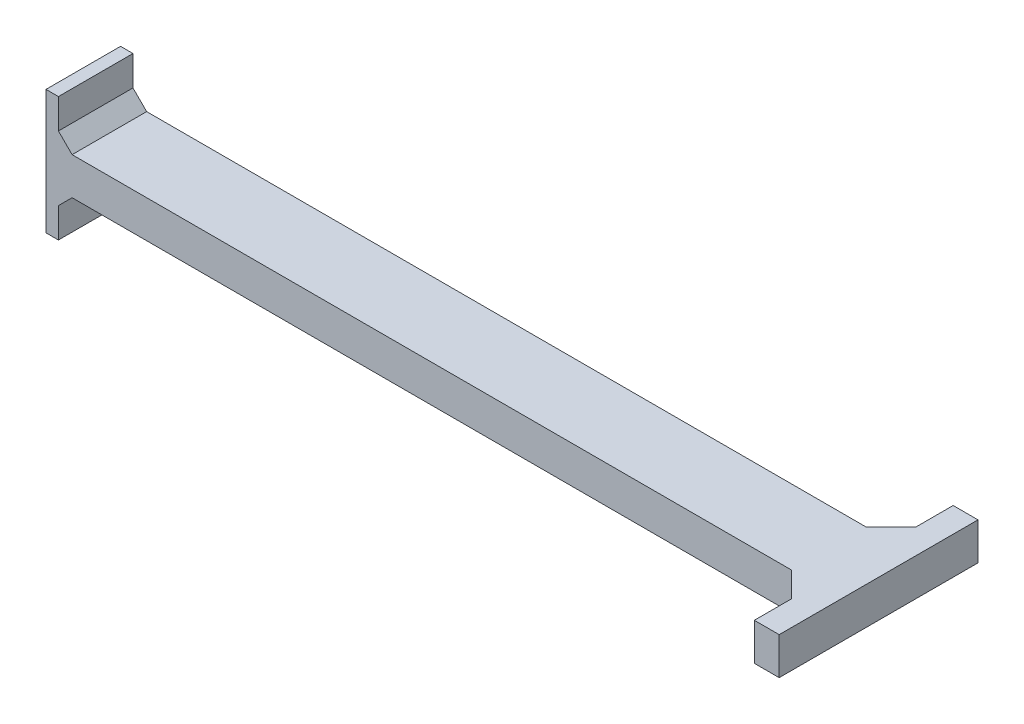
ISO-10303-21;
HEADER;
FILE_DESCRIPTION(('STEP AP214'),'2;1');
FILE_NAME('part.step','',(''),(''),'','','');
FILE_SCHEMA(('AUTOMOTIVE_DESIGN { 1 0 10303 214 1 1 1 1 }'));
ENDSEC;
DATA;
#1=APPLICATION_CONTEXT('core data for automotive mechanical design processes');
#2=APPLICATION_PROTOCOL_DEFINITION('international standard','automotive_design',2000,#1);
#3=PRODUCT_CONTEXT('',#1,'mechanical');
#4=PRODUCT('Part','Part','',(#3));
#5=PRODUCT_RELATED_PRODUCT_CATEGORY('part','',(#4));
#6=PRODUCT_DEFINITION_FORMATION('','',#4);
#7=PRODUCT_DEFINITION_CONTEXT('part definition',#1,'design');
#8=PRODUCT_DEFINITION('design','',#6,#7);
#9=PRODUCT_DEFINITION_SHAPE('','',#8);
#10=(LENGTH_UNIT() NAMED_UNIT(*) SI_UNIT(.MILLI.,.METRE.));
#11=(NAMED_UNIT(*) PLANE_ANGLE_UNIT() SI_UNIT($,.RADIAN.));
#12=(NAMED_UNIT(*) SI_UNIT($,.STERADIAN.) SOLID_ANGLE_UNIT());
#13=UNCERTAINTY_MEASURE_WITH_UNIT(LENGTH_MEASURE(1.E-05),#10,'distance_accuracy_value','');
#14=(GEOMETRIC_REPRESENTATION_CONTEXT(3) GLOBAL_UNCERTAINTY_ASSIGNED_CONTEXT((#13)) GLOBAL_UNIT_ASSIGNED_CONTEXT((#10,
#11,#12)) REPRESENTATION_CONTEXT('',''));
#15=CARTESIAN_POINT('',(0.,0.,0.));
#16=DIRECTION('',(0.,0.,1.));
#17=DIRECTION('',(1.,0.,0.));
#18=AXIS2_PLACEMENT_3D('',#15,#16,#17);
#19=CARTESIAN_POINT('',(-367.665,0.,38.1));
#20=DIRECTION('',(0.,1.,0.));
#21=DIRECTION('',(0.,0.,1.));
#22=AXIS2_PLACEMENT_3D('',#19,#20,#21);
#23=PLANE('',#22);
#24=DIRECTION('',(1.,0.,0.));
#25=VECTOR('',#24,1.);
#26=CARTESIAN_POINT('',(-367.665,0.,0.));
#27=LINE('',#26,#25);
#28=CARTESIAN_POINT('',(-367.665,0.,0.));
#29=VERTEX_POINT('',#28);
#30=CARTESIAN_POINT('',(0.,0.,0.));
#31=VERTEX_POINT('',#30);
#32=EDGE_CURVE('E145',#29,#31,#27,.T.);
#33=ORIENTED_EDGE('',*,*,#32,.T.);
#34=DIRECTION('',(-0.707106781186549,0.,0.707106781186546));
#35=VECTOR('',#34,1.);
#36=CARTESIAN_POINT('',(0.,0.,0.));
#37=LINE('',#36,#35);
#38=CARTESIAN_POINT('',(12.7,0.,-12.7));
#39=VERTEX_POINT('',#38);
#40=EDGE_CURVE('E209',#39,#31,#37,.T.);
#41=ORIENTED_EDGE('',*,*,#40,.F.);
#42=DIRECTION('',(0.,0.,1.));
#43=VECTOR('',#42,1.);
#44=CARTESIAN_POINT('',(12.7,0.,-12.7));
#45=LINE('',#44,#43);
#46=CARTESIAN_POINT('',(12.7,0.,-31.75));
#47=VERTEX_POINT('',#46);
#48=EDGE_CURVE('E206',#47,#39,#45,.T.);
#49=ORIENTED_EDGE('',*,*,#48,.F.);
#50=DIRECTION('',(-1.,0.,0.));
#51=VECTOR('',#50,1.);
#52=CARTESIAN_POINT('',(12.7,0.,-31.75));
#53=LINE('',#52,#51);
#54=CARTESIAN_POINT('',(25.4,0.,-31.75));
#55=VERTEX_POINT('',#54);
#56=EDGE_CURVE('E149',#55,#47,#53,.T.);
#57=ORIENTED_EDGE('',*,*,#56,.F.);
#58=DIRECTION('',(0.,0.,-1.));
#59=VECTOR('',#58,1.);
#60=CARTESIAN_POINT('',(25.4,0.,-31.75));
#61=LINE('',#60,#59);
#62=CARTESIAN_POINT('',(25.4,0.,69.85));
#63=VERTEX_POINT('',#62);
#64=EDGE_CURVE('E251',#63,#55,#61,.T.);
#65=ORIENTED_EDGE('',*,*,#64,.F.);
#66=DIRECTION('',(1.,0.,0.));
#67=VECTOR('',#66,1.);
#68=CARTESIAN_POINT('',(25.4,0.,69.85));
#69=LINE('',#68,#67);
#70=CARTESIAN_POINT('',(12.7,0.,69.85));
#71=VERTEX_POINT('',#70);
#72=EDGE_CURVE('E254',#71,#63,#69,.T.);
#73=ORIENTED_EDGE('',*,*,#72,.F.);
#74=DIRECTION('',(0.,0.,1.));
#75=VECTOR('',#74,1.);
#76=CARTESIAN_POINT('',(12.7,0.,69.85));
#77=LINE('',#76,#75);
#78=CARTESIAN_POINT('',(12.7,0.,50.8));
#79=VERTEX_POINT('',#78);
#80=EDGE_CURVE('E257',#79,#71,#77,.T.);
#81=ORIENTED_EDGE('',*,*,#80,.F.);
#82=DIRECTION('',(0.707106781186549,0.,0.707106781186546));
#83=VECTOR('',#82,1.);
#84=CARTESIAN_POINT('',(12.7,0.,50.8));
#85=LINE('',#84,#83);
#86=CARTESIAN_POINT('',(0.,0.,38.1));
#87=VERTEX_POINT('',#86);
#88=EDGE_CURVE('E260',#87,#79,#85,.T.);
#89=ORIENTED_EDGE('',*,*,#88,.F.);
#90=DIRECTION('',(1.,0.,0.));
#91=VECTOR('',#90,1.);
#92=CARTESIAN_POINT('',(-367.665,0.,38.1));
#93=LINE('',#92,#91);
#94=CARTESIAN_POINT('',(-367.665,0.,38.1));
#95=VERTEX_POINT('',#94);
#96=EDGE_CURVE('E99',#95,#87,#93,.T.);
#97=ORIENTED_EDGE('',*,*,#96,.F.);
#98=DIRECTION('',(0.,0.,-1.));
#99=VECTOR('',#98,1.);
#100=CARTESIAN_POINT('',(-367.665,0.,38.1));
#101=LINE('',#100,#99);
#102=EDGE_CURVE('E141',#95,#29,#101,.T.);
#103=ORIENTED_EDGE('',*,*,#102,.T.);
#104=EDGE_LOOP('',(#33,#41,#49,#57,#65,#73,#81,#89,#97,#103));
#105=FACE_BOUND('',#104,.T.);
#106=ADVANCED_FACE('F38',(#105),#23,.F.);
#107=CARTESIAN_POINT('',(0.,19.05,38.1));
#108=DIRECTION('',(0.,-1.,0.));
#109=DIRECTION('',(0.,0.,-1.));
#110=AXIS2_PLACEMENT_3D('',#107,#108,#109);
#111=PLANE('',#110);
#112=DIRECTION('',(-1.,0.,0.));
#113=VECTOR('',#112,1.);
#114=CARTESIAN_POINT('',(0.,19.05,0.));
#115=LINE('',#114,#113);
#116=CARTESIAN_POINT('',(0.,19.05,0.));
#117=VERTEX_POINT('',#116);
#118=CARTESIAN_POINT('',(-367.665,19.05,0.));
#119=VERTEX_POINT('',#118);
#120=EDGE_CURVE('E152',#117,#119,#115,.T.);
#121=ORIENTED_EDGE('',*,*,#120,.T.);
#122=DIRECTION('',(0.,0.,-1.));
#123=VECTOR('',#122,1.);
#124=CARTESIAN_POINT('',(-367.665,19.05,38.1));
#125=LINE('',#124,#123);
#126=CARTESIAN_POINT('',(-367.665,19.05,38.1));
#127=VERTEX_POINT('',#126);
#128=EDGE_CURVE('E11',#127,#119,#125,.T.);
#129=ORIENTED_EDGE('',*,*,#128,.F.);
#130=DIRECTION('',(-1.,0.,0.));
#131=VECTOR('',#130,1.);
#132=CARTESIAN_POINT('',(0.,19.05,38.1));
#133=LINE('',#132,#131);
#134=CARTESIAN_POINT('',(0.,19.05,38.1));
#135=VERTEX_POINT('',#134);
#136=EDGE_CURVE('E201',#135,#127,#133,.T.);
#137=ORIENTED_EDGE('',*,*,#136,.F.);
#138=DIRECTION('',(-0.707106781186549,0.,-0.707106781186546));
#139=VECTOR('',#138,1.);
#140=CARTESIAN_POINT('',(12.7,19.05,50.8));
#141=LINE('',#140,#139);
#142=CARTESIAN_POINT('',(12.7,19.05,50.8));
#143=VERTEX_POINT('',#142);
#144=EDGE_CURVE('E234',#143,#135,#141,.T.);
#145=ORIENTED_EDGE('',*,*,#144,.F.);
#146=DIRECTION('',(0.,0.,-1.));
#147=VECTOR('',#146,1.);
#148=CARTESIAN_POINT('',(12.7,19.05,69.85));
#149=LINE('',#148,#147);
#150=CARTESIAN_POINT('',(12.7,19.05,69.85));
#151=VERTEX_POINT('',#150);
#152=EDGE_CURVE('E237',#151,#143,#149,.T.);
#153=ORIENTED_EDGE('',*,*,#152,.F.);
#154=DIRECTION('',(-1.,0.,0.));
#155=VECTOR('',#154,1.);
#156=CARTESIAN_POINT('',(25.4,19.05,69.85));
#157=LINE('',#156,#155);
#158=CARTESIAN_POINT('',(25.4,19.05,69.85));
#159=VERTEX_POINT('',#158);
#160=EDGE_CURVE('E240',#159,#151,#157,.T.);
#161=ORIENTED_EDGE('',*,*,#160,.F.);
#162=DIRECTION('',(0.,0.,1.));
#163=VECTOR('',#162,1.);
#164=CARTESIAN_POINT('',(25.4,19.05,-31.75));
#165=LINE('',#164,#163);
#166=CARTESIAN_POINT('',(25.4,19.05,-31.75));
#167=VERTEX_POINT('',#166);
#168=EDGE_CURVE('E243',#167,#159,#165,.T.);
#169=ORIENTED_EDGE('',*,*,#168,.F.);
#170=DIRECTION('',(1.,0.,0.));
#171=VECTOR('',#170,1.);
#172=CARTESIAN_POINT('',(12.7,19.05,-31.75));
#173=LINE('',#172,#171);
#174=CARTESIAN_POINT('',(12.7,19.05,-31.75));
#175=VERTEX_POINT('',#174);
#176=EDGE_CURVE('E246',#175,#167,#173,.T.);
#177=ORIENTED_EDGE('',*,*,#176,.F.);
#178=DIRECTION('',(0.,0.,-1.));
#179=VECTOR('',#178,1.);
#180=CARTESIAN_POINT('',(12.7,19.05,-12.7));
#181=LINE('',#180,#179);
#182=CARTESIAN_POINT('',(12.7,19.05,-12.7));
#183=VERTEX_POINT('',#182);
#184=EDGE_CURVE('E228',#183,#175,#181,.T.);
#185=ORIENTED_EDGE('',*,*,#184,.F.);
#186=DIRECTION('',(0.707106781186549,0.,-0.707106781186546));
#187=VECTOR('',#186,1.);
#188=CARTESIAN_POINT('',(0.,19.05,0.));
#189=LINE('',#188,#187);
#190=EDGE_CURVE('E231',#117,#183,#189,.T.);
#191=ORIENTED_EDGE('',*,*,#190,.F.);
#192=EDGE_LOOP('',(#121,#129,#137,#145,#153,#161,#169,#177,#185,#191));
#193=FACE_BOUND('',#192,.T.);
#194=ADVANCED_FACE('F313',(#193),#111,.F.);
#195=CARTESIAN_POINT('',(-367.665,19.05,38.1));
#196=DIRECTION('',(-0.70710678118655,-0.707106781186545,0.));
#197=DIRECTION('',(0.707106781186545,-0.70710678118655,0.));
#198=AXIS2_PLACEMENT_3D('',#195,#196,#197);
#199=PLANE('',#198);
#200=DIRECTION('',(-0.707106781186545,0.70710678118655,0.));
#201=VECTOR('',#200,1.);
#202=CARTESIAN_POINT('',(-367.665,19.05,0.));
#203=LINE('',#202,#201);
#204=CARTESIAN_POINT('',(-374.65,26.035,0.));
#205=VERTEX_POINT('',#204);
#206=EDGE_CURVE('E154',#119,#205,#203,.T.);
#207=ORIENTED_EDGE('',*,*,#206,.T.);
#208=DIRECTION('',(0.,0.,-1.));
#209=VECTOR('',#208,1.);
#210=CARTESIAN_POINT('',(-374.65,26.035,38.1));
#211=LINE('',#210,#209);
#212=CARTESIAN_POINT('',(-374.65,26.035,38.1));
#213=VERTEX_POINT('',#212);
#214=EDGE_CURVE('E46',#213,#205,#211,.T.);
#215=ORIENTED_EDGE('',*,*,#214,.F.);
#216=DIRECTION('',(-0.707106781186545,0.70710678118655,0.));
#217=VECTOR('',#216,1.);
#218=CARTESIAN_POINT('',(-367.665,19.05,38.1));
#219=LINE('',#218,#217);
#220=EDGE_CURVE('E199',#127,#213,#219,.T.);
#221=ORIENTED_EDGE('',*,*,#220,.F.);
#222=ORIENTED_EDGE('',*,*,#128,.T.);
#223=EDGE_LOOP('',(#207,#215,#221,#222));
#224=FACE_BOUND('',#223,.T.);
#225=ADVANCED_FACE('F315',(#224),#199,.F.);
#226=CARTESIAN_POINT('',(-374.65,26.035,38.1));
#227=DIRECTION('',(-1.,0.,0.));
#228=DIRECTION('',(0.,0.,1.));
#229=AXIS2_PLACEMENT_3D('',#226,#227,#228);
#230=PLANE('',#229);
#231=DIRECTION('',(0.,1.,0.));
#232=VECTOR('',#231,1.);
#233=CARTESIAN_POINT('',(-374.65,26.035,0.));
#234=LINE('',#233,#232);
#235=CARTESIAN_POINT('',(-374.65,41.275,0.));
#236=VERTEX_POINT('',#235);
#237=EDGE_CURVE('E156',#205,#236,#234,.T.);
#238=ORIENTED_EDGE('',*,*,#237,.T.);
#239=DIRECTION('',(0.,0.,-1.));
#240=VECTOR('',#239,1.);
#241=CARTESIAN_POINT('',(-374.65,41.275,38.1));
#242=LINE('',#241,#240);
#243=CARTESIAN_POINT('',(-374.65,41.275,38.1));
#244=VERTEX_POINT('',#243);
#245=EDGE_CURVE('E171',#244,#236,#242,.T.);
#246=ORIENTED_EDGE('',*,*,#245,.F.);
#247=DIRECTION('',(0.,1.,0.));
#248=VECTOR('',#247,1.);
#249=CARTESIAN_POINT('',(-374.65,26.035,38.1));
#250=LINE('',#249,#248);
#251=EDGE_CURVE('E180',#213,#244,#250,.T.);
#252=ORIENTED_EDGE('',*,*,#251,.F.);
#253=ORIENTED_EDGE('',*,*,#214,.T.);
#254=EDGE_LOOP('',(#238,#246,#252,#253));
#255=FACE_BOUND('',#254,.T.);
#256=ADVANCED_FACE('F178',(#255),#230,.F.);
#257=CARTESIAN_POINT('',(-374.65,41.275,38.1));
#258=DIRECTION('',(0.,-1.,0.));
#259=DIRECTION('',(0.,0.,-1.));
#260=AXIS2_PLACEMENT_3D('',#257,#258,#259);
#261=PLANE('',#260);
#262=DIRECTION('',(-1.,0.,0.));
#263=VECTOR('',#262,1.);
#264=CARTESIAN_POINT('',(-374.65,41.275,0.));
#265=LINE('',#264,#263);
#266=CARTESIAN_POINT('',(-381.,41.275,0.));
#267=VERTEX_POINT('',#266);
#268=EDGE_CURVE('E158',#236,#267,#265,.T.);
#269=ORIENTED_EDGE('',*,*,#268,.T.);
#270=DIRECTION('',(0.,0.,-1.));
#271=VECTOR('',#270,1.);
#272=CARTESIAN_POINT('',(-381.,41.275,38.1));
#273=LINE('',#272,#271);
#274=CARTESIAN_POINT('',(-381.,41.275,38.1));
#275=VERTEX_POINT('',#274);
#276=EDGE_CURVE('E168',#275,#267,#273,.T.);
#277=ORIENTED_EDGE('',*,*,#276,.F.);
#278=DIRECTION('',(-1.,0.,0.));
#279=VECTOR('',#278,1.);
#280=CARTESIAN_POINT('',(-374.65,41.275,38.1));
#281=LINE('',#280,#279);
#282=EDGE_CURVE('E195',#244,#275,#281,.T.);
#283=ORIENTED_EDGE('',*,*,#282,.F.);
#284=ORIENTED_EDGE('',*,*,#245,.T.);
#285=EDGE_LOOP('',(#269,#277,#283,#284));
#286=FACE_BOUND('',#285,.T.);
#287=ADVANCED_FACE('F191',(#286),#261,.F.);
#288=CARTESIAN_POINT('',(-381.,41.275,38.1));
#289=DIRECTION('',(1.,0.,0.));
#290=DIRECTION('',(0.,0.,-1.));
#291=AXIS2_PLACEMENT_3D('',#288,#289,#290);
#292=PLANE('',#291);
#293=DIRECTION('',(0.,-1.,0.));
#294=VECTOR('',#293,1.);
#295=CARTESIAN_POINT('',(-381.,41.275,0.));
#296=LINE('',#295,#294);
#297=CARTESIAN_POINT('',(-381.,-22.225,0.));
#298=VERTEX_POINT('',#297);
#299=EDGE_CURVE('E160',#267,#298,#296,.T.);
#300=ORIENTED_EDGE('',*,*,#299,.T.);
#301=DIRECTION('',(0.,0.,-1.));
#302=VECTOR('',#301,1.);
#303=CARTESIAN_POINT('',(-381.,-22.225,38.1));
#304=LINE('',#303,#302);
#305=CARTESIAN_POINT('',(-381.,-22.225,38.1));
#306=VERTEX_POINT('',#305);
#307=EDGE_CURVE('E136',#306,#298,#304,.T.);
#308=ORIENTED_EDGE('',*,*,#307,.F.);
#309=DIRECTION('',(0.,-1.,0.));
#310=VECTOR('',#309,1.);
#311=CARTESIAN_POINT('',(-381.,41.275,38.1));
#312=LINE('',#311,#310);
#313=EDGE_CURVE('E127',#275,#306,#312,.T.);
#314=ORIENTED_EDGE('',*,*,#313,.F.);
#315=ORIENTED_EDGE('',*,*,#276,.T.);
#316=EDGE_LOOP('',(#300,#308,#314,#315));
#317=FACE_BOUND('',#316,.T.);
#318=ADVANCED_FACE('F194',(#317),#292,.F.);
#319=CARTESIAN_POINT('',(-381.,-22.225,38.1));
#320=DIRECTION('',(0.,1.,0.));
#321=DIRECTION('',(0.,0.,1.));
#322=AXIS2_PLACEMENT_3D('',#319,#320,#321);
#323=PLANE('',#322);
#324=DIRECTION('',(1.,0.,0.));
#325=VECTOR('',#324,1.);
#326=CARTESIAN_POINT('',(-381.,-22.225,0.));
#327=LINE('',#326,#325);
#328=CARTESIAN_POINT('',(-374.65,-22.225,0.));
#329=VERTEX_POINT('',#328);
#330=EDGE_CURVE('E135',#298,#329,#327,.T.);
#331=ORIENTED_EDGE('',*,*,#330,.T.);
#332=DIRECTION('',(0.,0.,-1.));
#333=VECTOR('',#332,1.);
#334=CARTESIAN_POINT('',(-374.65,-22.225,38.1));
#335=LINE('',#334,#333);
#336=CARTESIAN_POINT('',(-374.65,-22.225,38.1));
#337=VERTEX_POINT('',#336);
#338=EDGE_CURVE('E132',#337,#329,#335,.T.);
#339=ORIENTED_EDGE('',*,*,#338,.F.);
#340=DIRECTION('',(1.,0.,0.));
#341=VECTOR('',#340,1.);
#342=CARTESIAN_POINT('',(-381.,-22.225,38.1));
#343=LINE('',#342,#341);
#344=EDGE_CURVE('E121',#306,#337,#343,.T.);
#345=ORIENTED_EDGE('',*,*,#344,.F.);
#346=ORIENTED_EDGE('',*,*,#307,.T.);
#347=EDGE_LOOP('',(#331,#339,#345,#346));
#348=FACE_BOUND('',#347,.T.);
#349=ADVANCED_FACE('F133',(#348),#323,.F.);
#350=CARTESIAN_POINT('',(-374.65,-22.225,38.1));
#351=DIRECTION('',(-1.,0.,0.));
#352=DIRECTION('',(0.,0.,1.));
#353=AXIS2_PLACEMENT_3D('',#350,#351,#352);
#354=PLANE('',#353);
#355=DIRECTION('',(0.,1.,0.));
#356=VECTOR('',#355,1.);
#357=CARTESIAN_POINT('',(-374.65,-22.225,0.));
#358=LINE('',#357,#356);
#359=CARTESIAN_POINT('',(-374.65,-6.985,0.));
#360=VERTEX_POINT('',#359);
#361=EDGE_CURVE('E87',#329,#360,#358,.T.);
#362=ORIENTED_EDGE('',*,*,#361,.T.);
#363=DIRECTION('',(0.,0.,-1.));
#364=VECTOR('',#363,1.);
#365=CARTESIAN_POINT('',(-374.65,-6.985,38.1));
#366=LINE('',#365,#364);
#367=CARTESIAN_POINT('',(-374.65,-6.985,38.1));
#368=VERTEX_POINT('',#367);
#369=EDGE_CURVE('E137',#368,#360,#366,.T.);
#370=ORIENTED_EDGE('',*,*,#369,.F.);
#371=DIRECTION('',(0.,1.,0.));
#372=VECTOR('',#371,1.);
#373=CARTESIAN_POINT('',(-374.65,-22.225,38.1));
#374=LINE('',#373,#372);
#375=EDGE_CURVE('E125',#337,#368,#374,.T.);
#376=ORIENTED_EDGE('',*,*,#375,.F.);
#377=ORIENTED_EDGE('',*,*,#338,.T.);
#378=EDGE_LOOP('',(#362,#370,#376,#377));
#379=FACE_BOUND('',#378,.T.);
#380=ADVANCED_FACE('F139',(#379),#354,.F.);
#381=CARTESIAN_POINT('',(-374.65,-6.985,38.1));
#382=DIRECTION('',(-0.70710678118655,0.707106781186546,0.));
#383=DIRECTION('',(-0.707106781186546,-0.70710678118655,0.));
#384=AXIS2_PLACEMENT_3D('',#381,#382,#383);
#385=PLANE('',#384);
#386=DIRECTION('',(0.707106781186546,0.70710678118655,0.));
#387=VECTOR('',#386,1.);
#388=CARTESIAN_POINT('',(-374.65,-6.985,0.));
#389=LINE('',#388,#387);
#390=EDGE_CURVE('E93',#360,#29,#389,.T.);
#391=ORIENTED_EDGE('',*,*,#390,.T.);
#392=ORIENTED_EDGE('',*,*,#102,.F.);
#393=DIRECTION('',(0.707106781186546,0.70710678118655,0.));
#394=VECTOR('',#393,1.);
#395=CARTESIAN_POINT('',(-374.65,-6.985,38.1));
#396=LINE('',#395,#394);
#397=EDGE_CURVE('E54',#368,#95,#396,.T.);
#398=ORIENTED_EDGE('',*,*,#397,.F.);
#399=ORIENTED_EDGE('',*,*,#369,.T.);
#400=EDGE_LOOP('',(#391,#392,#398,#399));
#401=FACE_BOUND('',#400,.T.);
#402=ADVANCED_FACE('F332',(#401),#385,.F.);
#403=CARTESIAN_POINT('',(0.,0.,38.1));
#404=DIRECTION('',(0.,0.,1.));
#405=DIRECTION('',(1.,0.,0.));
#406=AXIS2_PLACEMENT_3D('',#403,#404,#405);
#407=PLANE('',#406);
#408=ORIENTED_EDGE('',*,*,#96,.T.);
#409=DIRECTION('',(0.,1.,0.));
#410=VECTOR('',#409,1.);
#411=CARTESIAN_POINT('',(0.,0.,38.1));
#412=LINE('',#411,#410);
#413=EDGE_CURVE('E203',#87,#135,#412,.T.);
#414=ORIENTED_EDGE('',*,*,#413,.T.);
#415=ORIENTED_EDGE('',*,*,#136,.T.);
#416=ORIENTED_EDGE('',*,*,#220,.T.);
#417=ORIENTED_EDGE('',*,*,#251,.T.);
#418=ORIENTED_EDGE('',*,*,#282,.T.);
#419=ORIENTED_EDGE('',*,*,#313,.T.);
#420=ORIENTED_EDGE('',*,*,#344,.T.);
#421=ORIENTED_EDGE('',*,*,#375,.T.);
#422=ORIENTED_EDGE('',*,*,#397,.T.);
#423=EDGE_LOOP('',(#408,#414,#415,#416,#417,#418,#419,#420,#421,#422));
#424=FACE_BOUND('',#423,.T.);
#425=ADVANCED_FACE('F123',(#424),#407,.T.);
#426=CARTESIAN_POINT('',(0.,0.,0.));
#427=DIRECTION('',(0.,0.,1.));
#428=DIRECTION('',(1.,0.,0.));
#429=AXIS2_PLACEMENT_3D('',#426,#427,#428);
#430=PLANE('',#429);
#431=ORIENTED_EDGE('',*,*,#32,.F.);
#432=ORIENTED_EDGE('',*,*,#390,.F.);
#433=ORIENTED_EDGE('',*,*,#361,.F.);
#434=ORIENTED_EDGE('',*,*,#330,.F.);
#435=ORIENTED_EDGE('',*,*,#299,.F.);
#436=ORIENTED_EDGE('',*,*,#268,.F.);
#437=ORIENTED_EDGE('',*,*,#237,.F.);
#438=ORIENTED_EDGE('',*,*,#206,.F.);
#439=ORIENTED_EDGE('',*,*,#120,.F.);
#440=DIRECTION('',(0.,1.,0.));
#441=VECTOR('',#440,1.);
#442=CARTESIAN_POINT('',(0.,0.,0.));
#443=LINE('',#442,#441);
#444=EDGE_CURVE('E148',#31,#117,#443,.T.);
#445=ORIENTED_EDGE('',*,*,#444,.F.);
#446=EDGE_LOOP('',(#431,#432,#433,#434,#435,#436,#437,#438,#439,#445));
#447=FACE_BOUND('',#446,.T.);
#448=ADVANCED_FACE('F187',(#447),#430,.F.);
#449=CARTESIAN_POINT('',(12.7,-104.726882890689,-12.7));
#450=DIRECTION('',(1.,0.,0.));
#451=DIRECTION('',(0.,1.,0.));
#452=AXIS2_PLACEMENT_3D('',#449,#450,#451);
#453=PLANE('',#452);
#454=DIRECTION('',(0.,1.,0.));
#455=VECTOR('',#454,1.);
#456=CARTESIAN_POINT('',(12.7,-104.726882890689,-31.75));
#457=LINE('',#456,#455);
#458=EDGE_CURVE('E225',#47,#175,#457,.T.);
#459=ORIENTED_EDGE('',*,*,#458,.F.);
#460=ORIENTED_EDGE('',*,*,#48,.T.);
#461=DIRECTION('',(0.,1.,0.));
#462=VECTOR('',#461,1.);
#463=CARTESIAN_POINT('',(12.7,-104.726882890689,-12.7));
#464=LINE('',#463,#462);
#465=EDGE_CURVE('E222',#39,#183,#464,.T.);
#466=ORIENTED_EDGE('',*,*,#465,.T.);
#467=ORIENTED_EDGE('',*,*,#184,.T.);
#468=EDGE_LOOP('',(#459,#460,#466,#467));
#469=FACE_BOUND('',#468,.T.);
#470=ADVANCED_FACE('F351',(#469),#453,.F.);
#471=CARTESIAN_POINT('',(0.,-104.726882890689,0.));
#472=DIRECTION('',(0.707106781186546,0.,0.707106781186549));
#473=DIRECTION('',(0.707106781186549,0.,-0.707106781186546));
#474=AXIS2_PLACEMENT_3D('',#471,#472,#473);
#475=PLANE('',#474);
#476=ORIENTED_EDGE('',*,*,#465,.F.);
#477=ORIENTED_EDGE('',*,*,#40,.T.);
#478=ORIENTED_EDGE('',*,*,#444,.T.);
#479=ORIENTED_EDGE('',*,*,#190,.T.);
#480=EDGE_LOOP('',(#476,#477,#478,#479));
#481=FACE_BOUND('',#480,.T.);
#482=ADVANCED_FACE('F268',(#481),#475,.F.);
#483=CARTESIAN_POINT('',(12.7,-104.726882890689,50.8));
#484=DIRECTION('',(0.707106781186546,0.,-0.707106781186549));
#485=DIRECTION('',(-0.707106781186549,0.,-0.707106781186546));
#486=AXIS2_PLACEMENT_3D('',#483,#484,#485);
#487=PLANE('',#486);
#488=ORIENTED_EDGE('',*,*,#413,.F.);
#489=ORIENTED_EDGE('',*,*,#88,.T.);
#490=DIRECTION('',(0.,1.,0.));
#491=VECTOR('',#490,1.);
#492=CARTESIAN_POINT('',(12.7,-104.726882890689,50.8));
#493=LINE('',#492,#491);
#494=EDGE_CURVE('E219',#79,#143,#493,.T.);
#495=ORIENTED_EDGE('',*,*,#494,.T.);
#496=ORIENTED_EDGE('',*,*,#144,.T.);
#497=EDGE_LOOP('',(#488,#489,#495,#496));
#498=FACE_BOUND('',#497,.T.);
#499=ADVANCED_FACE('F308',(#498),#487,.F.);
#500=CARTESIAN_POINT('',(12.7,-104.726882890689,69.85));
#501=DIRECTION('',(1.,0.,0.));
#502=DIRECTION('',(0.,0.,-1.));
#503=AXIS2_PLACEMENT_3D('',#500,#501,#502);
#504=PLANE('',#503);
#505=ORIENTED_EDGE('',*,*,#494,.F.);
#506=ORIENTED_EDGE('',*,*,#80,.T.);
#507=DIRECTION('',(0.,1.,0.));
#508=VECTOR('',#507,1.);
#509=CARTESIAN_POINT('',(12.7,-104.726882890689,69.85));
#510=LINE('',#509,#508);
#511=EDGE_CURVE('E216',#71,#151,#510,.T.);
#512=ORIENTED_EDGE('',*,*,#511,.T.);
#513=ORIENTED_EDGE('',*,*,#152,.T.);
#514=EDGE_LOOP('',(#505,#506,#512,#513));
#515=FACE_BOUND('',#514,.T.);
#516=ADVANCED_FACE('F305',(#515),#504,.F.);
#517=CARTESIAN_POINT('',(25.4,-104.726882890689,69.85));
#518=DIRECTION('',(0.,0.,-1.));
#519=DIRECTION('',(-1.,0.,0.));
#520=AXIS2_PLACEMENT_3D('',#517,#518,#519);
#521=PLANE('',#520);
#522=ORIENTED_EDGE('',*,*,#511,.F.);
#523=ORIENTED_EDGE('',*,*,#72,.T.);
#524=DIRECTION('',(0.,1.,0.));
#525=VECTOR('',#524,1.);
#526=CARTESIAN_POINT('',(25.4,-104.726882890689,69.85));
#527=LINE('',#526,#525);
#528=EDGE_CURVE('E213',#63,#159,#527,.T.);
#529=ORIENTED_EDGE('',*,*,#528,.T.);
#530=ORIENTED_EDGE('',*,*,#160,.T.);
#531=EDGE_LOOP('',(#522,#523,#529,#530));
#532=FACE_BOUND('',#531,.T.);
#533=ADVANCED_FACE('F300',(#532),#521,.F.);
#534=CARTESIAN_POINT('',(25.4,-104.726882890689,-31.75));
#535=DIRECTION('',(-1.,0.,0.));
#536=DIRECTION('',(0.,-1.,0.));
#537=AXIS2_PLACEMENT_3D('',#534,#535,#536);
#538=PLANE('',#537);
#539=ORIENTED_EDGE('',*,*,#528,.F.);
#540=ORIENTED_EDGE('',*,*,#64,.T.);
#541=DIRECTION('',(0.,1.,0.));
#542=VECTOR('',#541,1.);
#543=CARTESIAN_POINT('',(25.4,-104.726882890689,-31.75));
#544=LINE('',#543,#542);
#545=EDGE_CURVE('E210',#55,#167,#544,.T.);
#546=ORIENTED_EDGE('',*,*,#545,.T.);
#547=ORIENTED_EDGE('',*,*,#168,.T.);
#548=EDGE_LOOP('',(#539,#540,#546,#547));
#549=FACE_BOUND('',#548,.T.);
#550=ADVANCED_FACE('F295',(#549),#538,.F.);
#551=CARTESIAN_POINT('',(12.7,-104.726882890689,-31.75));
#552=DIRECTION('',(0.,0.,1.));
#553=DIRECTION('',(1.,0.,0.));
#554=AXIS2_PLACEMENT_3D('',#551,#552,#553);
#555=PLANE('',#554);
#556=ORIENTED_EDGE('',*,*,#545,.F.);
#557=ORIENTED_EDGE('',*,*,#56,.T.);
#558=ORIENTED_EDGE('',*,*,#458,.T.);
#559=ORIENTED_EDGE('',*,*,#176,.T.);
#560=EDGE_LOOP('',(#556,#557,#558,#559));
#561=FACE_BOUND('',#560,.T.);
#562=ADVANCED_FACE('F394',(#561),#555,.F.);
#563=CLOSED_SHELL('',(#106,#194,#225,#256,#287,#318,#349,#380,#402,#425,#448,#470,#482,#499,
#516,#533,#550,#562));
#564=MANIFOLD_SOLID_BREP('B2',#563);
#565=ADVANCED_BREP_SHAPE_REPRESENTATION('',(#18,#564),#14);
#566=SHAPE_DEFINITION_REPRESENTATION(#9,#565);
ENDSEC;
END-ISO-10303-21;
